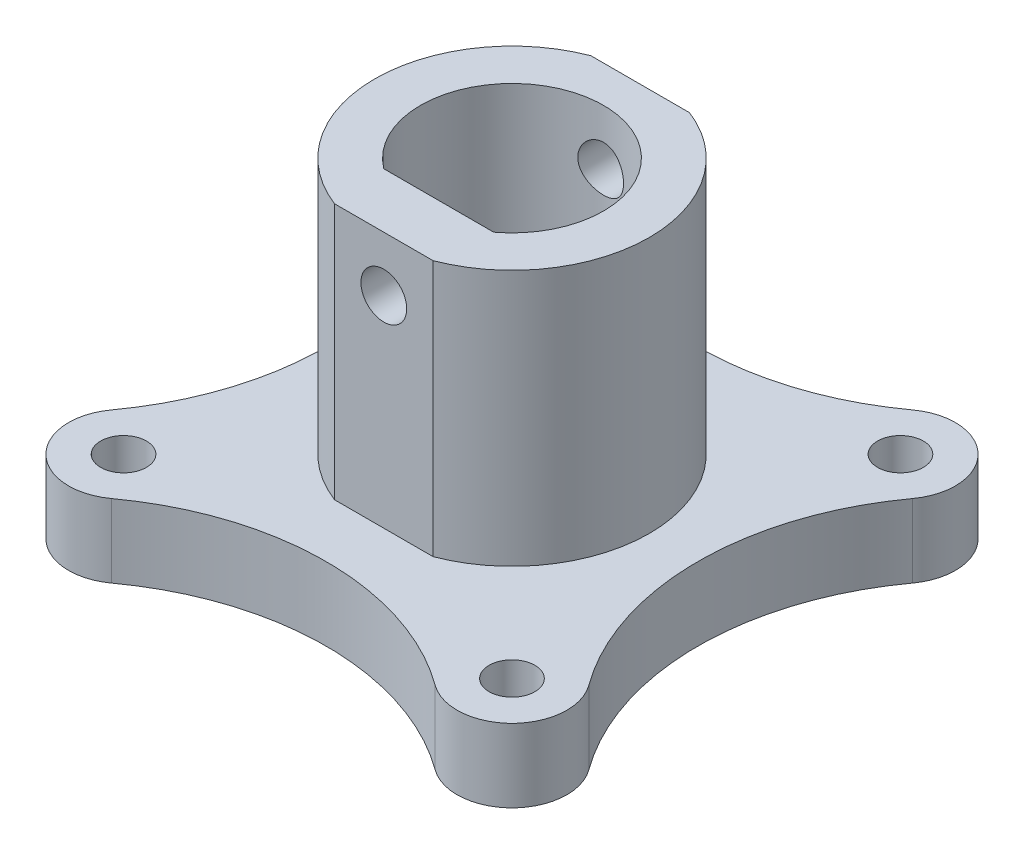
ISO-10303-21;
HEADER;
FILE_DESCRIPTION(('STEP AP214'),'2;1');
FILE_NAME('part.step','',(''),(''),'','','');
FILE_SCHEMA(('AUTOMOTIVE_DESIGN { 1 0 10303 214 1 1 1 1 }'));
ENDSEC;
DATA;
#1=APPLICATION_CONTEXT('core data for automotive mechanical design processes');
#2=APPLICATION_PROTOCOL_DEFINITION('international standard','automotive_design',2000,#1);
#3=PRODUCT_CONTEXT('',#1,'mechanical');
#4=PRODUCT('Part','Part','',(#3));
#5=PRODUCT_RELATED_PRODUCT_CATEGORY('part','',(#4));
#6=PRODUCT_DEFINITION_FORMATION('','',#4);
#7=PRODUCT_DEFINITION_CONTEXT('part definition',#1,'design');
#8=PRODUCT_DEFINITION('design','',#6,#7);
#9=PRODUCT_DEFINITION_SHAPE('','',#8);
#10=(LENGTH_UNIT() NAMED_UNIT(*) SI_UNIT(.MILLI.,.METRE.));
#11=(NAMED_UNIT(*) PLANE_ANGLE_UNIT() SI_UNIT($,.RADIAN.));
#12=(NAMED_UNIT(*) SI_UNIT($,.STERADIAN.) SOLID_ANGLE_UNIT());
#13=UNCERTAINTY_MEASURE_WITH_UNIT(LENGTH_MEASURE(1.E-05),#10,'distance_accuracy_value','');
#14=(GEOMETRIC_REPRESENTATION_CONTEXT(3) GLOBAL_UNCERTAINTY_ASSIGNED_CONTEXT((#13)) GLOBAL_UNIT_ASSIGNED_CONTEXT((#10,
#11,#12)) REPRESENTATION_CONTEXT('',''));
#15=CARTESIAN_POINT('',(0.,0.,0.));
#16=DIRECTION('',(0.,0.,1.));
#17=DIRECTION('',(1.,0.,0.));
#18=AXIS2_PLACEMENT_3D('',#15,#16,#17);
#19=CARTESIAN_POINT('',(-17.8781215039227,4.,-5.3033008588991));
#20=DIRECTION('',(0.,1.,0.));
#21=DIRECTION('',(0.,0.,1.));
#22=AXIS2_PLACEMENT_3D('',#19,#20,#21);
#23=PLANE('',#22);
#24=CARTESIAN_POINT('',(-10.6066017177982,4.,-10.6066017177982));
#25=DIRECTION('',(0.,1.,0.));
#26=DIRECTION('',(0.,0.,1.));
#27=AXIS2_PLACEMENT_3D('',#24,#25,#26);
#28=CIRCLE('',#27,1.24999999999999);
#29=CARTESIAN_POINT('',(-10.6066017177982,4.,-9.35660171779822));
#30=VERTEX_POINT('',#29);
#31=EDGE_CURVE('E337',#30,#30,#28,.T.);
#32=ORIENTED_EDGE('',*,*,#31,.F.);
#33=EDGE_LOOP('',(#32));
#34=FACE_BOUND('',#33,.T.);
#35=CARTESIAN_POINT('',(10.6066017177982,4.,-10.6066017177982));
#36=DIRECTION('',(0.,1.,0.));
#37=DIRECTION('',(0.,0.,1.));
#38=AXIS2_PLACEMENT_3D('',#35,#36,#37);
#39=CIRCLE('',#38,1.24999999999999);
#40=CARTESIAN_POINT('',(10.6066017177982,4.,-9.35660171779823));
#41=VERTEX_POINT('',#40);
#42=EDGE_CURVE('E343',#41,#41,#39,.T.);
#43=ORIENTED_EDGE('',*,*,#42,.F.);
#44=EDGE_LOOP('',(#43));
#45=FACE_BOUND('',#44,.T.);
#46=CARTESIAN_POINT('',(10.6066017177982,4.,10.6066017177982));
#47=DIRECTION('',(0.,1.,0.));
#48=DIRECTION('',(0.,0.,1.));
#49=AXIS2_PLACEMENT_3D('',#46,#47,#48);
#50=CIRCLE('',#49,1.24999999999999);
#51=CARTESIAN_POINT('',(10.6066017177982,4.,11.8566017177982));
#52=VERTEX_POINT('',#51);
#53=EDGE_CURVE('E349',#52,#52,#50,.T.);
#54=ORIENTED_EDGE('',*,*,#53,.F.);
#55=EDGE_LOOP('',(#54));
#56=FACE_BOUND('',#55,.T.);
#57=CARTESIAN_POINT('',(-10.6066017177982,4.,10.6066017177982));
#58=DIRECTION('',(0.,1.,0.));
#59=DIRECTION('',(0.,0.,1.));
#60=AXIS2_PLACEMENT_3D('',#57,#58,#59);
#61=CIRCLE('',#60,1.24999999999999);
#62=CARTESIAN_POINT('',(-10.6066017177982,4.,11.8566017177982));
#63=VERTEX_POINT('',#62);
#64=EDGE_CURVE('E164',#63,#63,#61,.T.);
#65=ORIENTED_EDGE('',*,*,#64,.F.);
#66=EDGE_LOOP('',(#65));
#67=FACE_BOUND('',#66,.T.);
#68=CARTESIAN_POINT('',(-25.1496412900472,4.,0.));
#69=DIRECTION('',(0.,-1.,0.));
#70=DIRECTION('',(0.,0.,1.));
#71=AXIS2_PLACEMENT_3D('',#68,#69,#70);
#72=CIRCLE('',#71,15.);
#73=CARTESIAN_POINT('',(-13.0304416465064,4.,-8.83883476483185));
#74=VERTEX_POINT('',#73);
#75=CARTESIAN_POINT('',(-13.0304416465064,4.,8.83883476483185));
#76=VERTEX_POINT('',#75);
#77=EDGE_CURVE('E198',#74,#76,#72,.T.);
#78=ORIENTED_EDGE('',*,*,#77,.T.);
#79=CARTESIAN_POINT('',(-10.6066017177982,4.,10.6066017177982));
#80=DIRECTION('',(0.,1.,0.));
#81=DIRECTION('',(0.,0.,1.));
#82=AXIS2_PLACEMENT_3D('',#79,#80,#81);
#83=CIRCLE('',#82,3.);
#84=CARTESIAN_POINT('',(-8.83883476483185,4.,13.0304416465064));
#85=VERTEX_POINT('',#84);
#86=EDGE_CURVE('E201',#76,#85,#83,.T.);
#87=ORIENTED_EDGE('',*,*,#86,.T.);
#88=CARTESIAN_POINT('',(0.,4.,25.1496412900472));
#89=DIRECTION('',(0.,-1.,0.));
#90=DIRECTION('',(0.,0.,1.));
#91=AXIS2_PLACEMENT_3D('',#88,#89,#90);
#92=CIRCLE('',#91,15.);
#93=CARTESIAN_POINT('',(8.83883476483185,4.,13.0304416465064));
#94=VERTEX_POINT('',#93);
#95=EDGE_CURVE('E204',#85,#94,#92,.T.);
#96=ORIENTED_EDGE('',*,*,#95,.T.);
#97=CARTESIAN_POINT('',(10.6066017177982,4.,10.6066017177982));
#98=DIRECTION('',(0.,1.,0.));
#99=DIRECTION('',(0.,0.,1.));
#100=AXIS2_PLACEMENT_3D('',#97,#98,#99);
#101=CIRCLE('',#100,3.);
#102=CARTESIAN_POINT('',(13.0304416465064,4.,8.83883476483184));
#103=VERTEX_POINT('',#102);
#104=EDGE_CURVE('E206',#94,#103,#101,.T.);
#105=ORIENTED_EDGE('',*,*,#104,.T.);
#106=CARTESIAN_POINT('',(25.1496412900472,4.,0.));
#107=DIRECTION('',(0.,-1.,0.));
#108=DIRECTION('',(0.,0.,1.));
#109=AXIS2_PLACEMENT_3D('',#106,#107,#108);
#110=CIRCLE('',#109,15.);
#111=CARTESIAN_POINT('',(13.0304416465064,4.,-8.83883476483184));
#112=VERTEX_POINT('',#111);
#113=EDGE_CURVE('E208',#103,#112,#110,.T.);
#114=ORIENTED_EDGE('',*,*,#113,.T.);
#115=CARTESIAN_POINT('',(10.6066017177982,4.,-10.6066017177982));
#116=DIRECTION('',(0.,1.,0.));
#117=DIRECTION('',(0.,0.,1.));
#118=AXIS2_PLACEMENT_3D('',#115,#116,#117);
#119=CIRCLE('',#118,3.);
#120=CARTESIAN_POINT('',(8.83883476483185,4.,-13.0304416465064));
#121=VERTEX_POINT('',#120);
#122=EDGE_CURVE('E210',#112,#121,#119,.T.);
#123=ORIENTED_EDGE('',*,*,#122,.T.);
#124=CARTESIAN_POINT('',(0.,4.,-25.1496412900472));
#125=DIRECTION('',(0.,-1.,0.));
#126=DIRECTION('',(0.,0.,1.));
#127=AXIS2_PLACEMENT_3D('',#124,#125,#126);
#128=CIRCLE('',#127,15.);
#129=CARTESIAN_POINT('',(-8.83883476483185,4.,-13.0304416465064));
#130=VERTEX_POINT('',#129);
#131=EDGE_CURVE('E212',#121,#130,#128,.T.);
#132=ORIENTED_EDGE('',*,*,#131,.T.);
#133=CARTESIAN_POINT('',(-10.6066017177982,4.,-10.6066017177982));
#134=DIRECTION('',(0.,1.,0.));
#135=DIRECTION('',(0.,0.,1.));
#136=AXIS2_PLACEMENT_3D('',#133,#134,#135);
#137=CIRCLE('',#136,3.);
#138=EDGE_CURVE('E214',#130,#74,#137,.T.);
#139=ORIENTED_EDGE('',*,*,#138,.T.);
#140=EDGE_LOOP('',(#78,#87,#96,#105,#114,#123,#132,#139));
#141=FACE_BOUND('',#140,.T.);
#142=DIRECTION('',(1.,0.,0.));
#143=VECTOR('',#142,1.);
#144=CARTESIAN_POINT('',(-2.69258240356725,4.,7.));
#145=LINE('',#144,#143);
#146=CARTESIAN_POINT('',(-2.69258240356725,4.,7.));
#147=VERTEX_POINT('',#146);
#148=CARTESIAN_POINT('',(2.69258240356725,4.,7.));
#149=VERTEX_POINT('',#148);
#150=EDGE_CURVE('E181',#147,#149,#145,.T.);
#151=ORIENTED_EDGE('',*,*,#150,.F.);
#152=CARTESIAN_POINT('',(0.,4.,0.));
#153=DIRECTION('',(0.,1.,0.));
#154=DIRECTION('',(0.,0.,1.));
#155=AXIS2_PLACEMENT_3D('',#152,#153,#154);
#156=CIRCLE('',#155,7.5);
#157=CARTESIAN_POINT('',(-2.69258240356725,4.,-7.));
#158=VERTEX_POINT('',#157);
#159=EDGE_CURVE('E158',#158,#147,#156,.T.);
#160=ORIENTED_EDGE('',*,*,#159,.F.);
#161=DIRECTION('',(-1.,0.,0.));
#162=VECTOR('',#161,1.);
#163=CARTESIAN_POINT('',(-2.69258240356725,4.,-7.));
#164=LINE('',#163,#162);
#165=CARTESIAN_POINT('',(2.69258240356725,4.,-7.));
#166=VERTEX_POINT('',#165);
#167=EDGE_CURVE('E172',#166,#158,#164,.T.);
#168=ORIENTED_EDGE('',*,*,#167,.F.);
#169=CARTESIAN_POINT('',(0.,4.,0.));
#170=DIRECTION('',(0.,1.,0.));
#171=DIRECTION('',(0.,0.,1.));
#172=AXIS2_PLACEMENT_3D('',#169,#170,#171);
#173=CIRCLE('',#172,7.5);
#174=EDGE_CURVE('E183',#149,#166,#173,.T.);
#175=ORIENTED_EDGE('',*,*,#174,.F.);
#176=EDGE_LOOP('',(#151,#160,#168,#175));
#177=FACE_BOUND('',#176,.T.);
#178=ADVANCED_FACE('F37',(#34,#45,#56,#67,#141,#177),#23,.T.);
#179=CARTESIAN_POINT('',(-17.8781215039227,0.,-5.3033008588991));
#180=DIRECTION('',(0.,1.,0.));
#181=DIRECTION('',(0.,0.,1.));
#182=AXIS2_PLACEMENT_3D('',#179,#180,#181);
#183=PLANE('',#182);
#184=CARTESIAN_POINT('',(-10.6066017177982,0.,-10.6066017177982));
#185=DIRECTION('',(0.,1.,0.));
#186=DIRECTION('',(0.,0.,1.));
#187=AXIS2_PLACEMENT_3D('',#184,#185,#186);
#188=CIRCLE('',#187,1.25);
#189=CARTESIAN_POINT('',(-10.6066017177982,0.,-9.35660171779821));
#190=VERTEX_POINT('',#189);
#191=EDGE_CURVE('E340',#190,#190,#188,.T.);
#192=ORIENTED_EDGE('',*,*,#191,.T.);
#193=EDGE_LOOP('',(#192));
#194=FACE_BOUND('',#193,.T.);
#195=CARTESIAN_POINT('',(10.6066017177982,0.,-10.6066017177982));
#196=DIRECTION('',(0.,1.,0.));
#197=DIRECTION('',(0.,0.,1.));
#198=AXIS2_PLACEMENT_3D('',#195,#196,#197);
#199=CIRCLE('',#198,1.25);
#200=CARTESIAN_POINT('',(10.6066017177982,0.,-9.35660171779821));
#201=VERTEX_POINT('',#200);
#202=EDGE_CURVE('E346',#201,#201,#199,.T.);
#203=ORIENTED_EDGE('',*,*,#202,.T.);
#204=EDGE_LOOP('',(#203));
#205=FACE_BOUND('',#204,.T.);
#206=CARTESIAN_POINT('',(10.6066017177982,0.,10.6066017177982));
#207=DIRECTION('',(0.,1.,0.));
#208=DIRECTION('',(0.,0.,1.));
#209=AXIS2_PLACEMENT_3D('',#206,#207,#208);
#210=CIRCLE('',#209,1.25);
#211=CARTESIAN_POINT('',(10.6066017177982,0.,11.8566017177982));
#212=VERTEX_POINT('',#211);
#213=EDGE_CURVE('E352',#212,#212,#210,.T.);
#214=ORIENTED_EDGE('',*,*,#213,.T.);
#215=EDGE_LOOP('',(#214));
#216=FACE_BOUND('',#215,.T.);
#217=CARTESIAN_POINT('',(-10.6066017177982,0.,10.6066017177982));
#218=DIRECTION('',(0.,1.,0.));
#219=DIRECTION('',(0.,0.,1.));
#220=AXIS2_PLACEMENT_3D('',#217,#218,#219);
#221=CIRCLE('',#220,1.25);
#222=CARTESIAN_POINT('',(-10.6066017177982,0.,11.8566017177982));
#223=VERTEX_POINT('',#222);
#224=EDGE_CURVE('E161',#223,#223,#221,.T.);
#225=ORIENTED_EDGE('',*,*,#224,.T.);
#226=EDGE_LOOP('',(#225));
#227=FACE_BOUND('',#226,.T.);
#228=CARTESIAN_POINT('',(-25.1496412900472,0.,0.));
#229=DIRECTION('',(0.,-1.,0.));
#230=DIRECTION('',(0.,0.,1.));
#231=AXIS2_PLACEMENT_3D('',#228,#229,#230);
#232=CIRCLE('',#231,15.);
#233=CARTESIAN_POINT('',(-13.0304416465064,0.,-8.83883476483185));
#234=VERTEX_POINT('',#233);
#235=CARTESIAN_POINT('',(-13.0304416465064,0.,8.83883476483185));
#236=VERTEX_POINT('',#235);
#237=EDGE_CURVE('E197',#234,#236,#232,.T.);
#238=ORIENTED_EDGE('',*,*,#237,.F.);
#239=CARTESIAN_POINT('',(-10.6066017177982,0.,-10.6066017177982));
#240=DIRECTION('',(0.,1.,0.));
#241=DIRECTION('',(0.,0.,1.));
#242=AXIS2_PLACEMENT_3D('',#239,#240,#241);
#243=CIRCLE('',#242,3.);
#244=CARTESIAN_POINT('',(-8.83883476483185,0.,-13.0304416465064));
#245=VERTEX_POINT('',#244);
#246=EDGE_CURVE('E202',#245,#234,#243,.T.);
#247=ORIENTED_EDGE('',*,*,#246,.F.);
#248=CARTESIAN_POINT('',(0.,0.,-25.1496412900472));
#249=DIRECTION('',(0.,-1.,0.));
#250=DIRECTION('',(0.,0.,1.));
#251=AXIS2_PLACEMENT_3D('',#248,#249,#250);
#252=CIRCLE('',#251,15.);
#253=CARTESIAN_POINT('',(8.83883476483185,0.,-13.0304416465064));
#254=VERTEX_POINT('',#253);
#255=EDGE_CURVE('E229',#254,#245,#252,.T.);
#256=ORIENTED_EDGE('',*,*,#255,.F.);
#257=CARTESIAN_POINT('',(10.6066017177982,0.,-10.6066017177982));
#258=DIRECTION('',(0.,1.,0.));
#259=DIRECTION('',(0.,0.,1.));
#260=AXIS2_PLACEMENT_3D('',#257,#258,#259);
#261=CIRCLE('',#260,3.);
#262=CARTESIAN_POINT('',(13.0304416465064,0.,-8.83883476483184));
#263=VERTEX_POINT('',#262);
#264=EDGE_CURVE('E227',#263,#254,#261,.T.);
#265=ORIENTED_EDGE('',*,*,#264,.F.);
#266=CARTESIAN_POINT('',(25.1496412900472,0.,0.));
#267=DIRECTION('',(0.,-1.,0.));
#268=DIRECTION('',(0.,0.,1.));
#269=AXIS2_PLACEMENT_3D('',#266,#267,#268);
#270=CIRCLE('',#269,15.);
#271=CARTESIAN_POINT('',(13.0304416465064,0.,8.83883476483184));
#272=VERTEX_POINT('',#271);
#273=EDGE_CURVE('E225',#272,#263,#270,.T.);
#274=ORIENTED_EDGE('',*,*,#273,.F.);
#275=CARTESIAN_POINT('',(10.6066017177982,0.,10.6066017177982));
#276=DIRECTION('',(0.,1.,0.));
#277=DIRECTION('',(0.,0.,1.));
#278=AXIS2_PLACEMENT_3D('',#275,#276,#277);
#279=CIRCLE('',#278,3.);
#280=CARTESIAN_POINT('',(8.83883476483185,0.,13.0304416465064));
#281=VERTEX_POINT('',#280);
#282=EDGE_CURVE('E223',#281,#272,#279,.T.);
#283=ORIENTED_EDGE('',*,*,#282,.F.);
#284=CARTESIAN_POINT('',(0.,0.,25.1496412900472));
#285=DIRECTION('',(0.,-1.,0.));
#286=DIRECTION('',(0.,0.,1.));
#287=AXIS2_PLACEMENT_3D('',#284,#285,#286);
#288=CIRCLE('',#287,15.);
#289=CARTESIAN_POINT('',(-8.83883476483185,0.,13.0304416465064));
#290=VERTEX_POINT('',#289);
#291=EDGE_CURVE('E221',#290,#281,#288,.T.);
#292=ORIENTED_EDGE('',*,*,#291,.F.);
#293=CARTESIAN_POINT('',(-10.6066017177982,0.,10.6066017177982));
#294=DIRECTION('',(0.,1.,0.));
#295=DIRECTION('',(0.,0.,1.));
#296=AXIS2_PLACEMENT_3D('',#293,#294,#295);
#297=CIRCLE('',#296,3.);
#298=EDGE_CURVE('E219',#236,#290,#297,.T.);
#299=ORIENTED_EDGE('',*,*,#298,.F.);
#300=EDGE_LOOP('',(#238,#247,#256,#265,#274,#283,#292,#299));
#301=FACE_BOUND('',#300,.T.);
#302=CARTESIAN_POINT('',(0.,0.,0.));
#303=DIRECTION('',(0.,1.,0.));
#304=DIRECTION('',(0.,0.,1.));
#305=AXIS2_PLACEMENT_3D('',#302,#303,#304);
#306=CIRCLE('',#305,5.);
#307=CARTESIAN_POINT('',(3.,0.,4.));
#308=VERTEX_POINT('',#307);
#309=CARTESIAN_POINT('',(-3.,0.,4.));
#310=VERTEX_POINT('',#309);
#311=EDGE_CURVE('E66',#308,#310,#306,.T.);
#312=ORIENTED_EDGE('',*,*,#311,.T.);
#313=DIRECTION('',(1.,0.,0.));
#314=VECTOR('',#313,1.);
#315=CARTESIAN_POINT('',(-3.,0.,4.));
#316=LINE('',#315,#314);
#317=EDGE_CURVE('E153',#310,#308,#316,.T.);
#318=ORIENTED_EDGE('',*,*,#317,.T.);
#319=EDGE_LOOP('',(#312,#318));
#320=FACE_BOUND('',#319,.T.);
#321=ADVANCED_FACE('F260',(#194,#205,#216,#227,#301,#320),#183,.F.);
#322=CARTESIAN_POINT('',(-25.1496412900472,4.,0.));
#323=DIRECTION('',(0.,-1.,0.));
#324=DIRECTION('',(0.,0.,-1.));
#325=AXIS2_PLACEMENT_3D('',#322,#323,#324);
#326=CYLINDRICAL_SURFACE('',#325,15.);
#327=ORIENTED_EDGE('',*,*,#237,.T.);
#328=DIRECTION('',(0.,-1.,0.));
#329=VECTOR('',#328,1.);
#330=CARTESIAN_POINT('',(-13.0304416465064,4.,8.83883476483185));
#331=LINE('',#330,#329);
#332=EDGE_CURVE('E11',#76,#236,#331,.T.);
#333=ORIENTED_EDGE('',*,*,#332,.F.);
#334=ORIENTED_EDGE('',*,*,#77,.F.);
#335=DIRECTION('',(0.,-1.,0.));
#336=VECTOR('',#335,1.);
#337=CARTESIAN_POINT('',(-13.0304416465064,4.,-8.83883476483185));
#338=LINE('',#337,#336);
#339=EDGE_CURVE('E216',#74,#234,#338,.T.);
#340=ORIENTED_EDGE('',*,*,#339,.T.);
#341=EDGE_LOOP('',(#327,#333,#334,#340));
#342=FACE_BOUND('',#341,.T.);
#343=ADVANCED_FACE('F39',(#342),#326,.F.);
#344=CARTESIAN_POINT('',(-10.6066017177982,4.,10.6066017177982));
#345=DIRECTION('',(0.,-1.,0.));
#346=DIRECTION('',(0.,0.,-1.));
#347=AXIS2_PLACEMENT_3D('',#344,#345,#346);
#348=CYLINDRICAL_SURFACE('',#347,3.);
#349=ORIENTED_EDGE('',*,*,#298,.T.);
#350=DIRECTION('',(0.,-1.,0.));
#351=VECTOR('',#350,1.);
#352=CARTESIAN_POINT('',(-8.83883476483185,4.,13.0304416465064));
#353=LINE('',#352,#351);
#354=EDGE_CURVE('E51',#85,#290,#353,.T.);
#355=ORIENTED_EDGE('',*,*,#354,.F.);
#356=ORIENTED_EDGE('',*,*,#86,.F.);
#357=ORIENTED_EDGE('',*,*,#332,.T.);
#358=EDGE_LOOP('',(#349,#355,#356,#357));
#359=FACE_BOUND('',#358,.T.);
#360=ADVANCED_FACE('F278',(#359),#348,.T.);
#361=CARTESIAN_POINT('',(0.,4.,25.1496412900472));
#362=DIRECTION('',(0.,-1.,0.));
#363=DIRECTION('',(0.,0.,-1.));
#364=AXIS2_PLACEMENT_3D('',#361,#362,#363);
#365=CYLINDRICAL_SURFACE('',#364,15.);
#366=ORIENTED_EDGE('',*,*,#291,.T.);
#367=DIRECTION('',(0.,-1.,0.));
#368=VECTOR('',#367,1.);
#369=CARTESIAN_POINT('',(8.83883476483185,4.,13.0304416465064));
#370=LINE('',#369,#368);
#371=EDGE_CURVE('E246',#94,#281,#370,.T.);
#372=ORIENTED_EDGE('',*,*,#371,.F.);
#373=ORIENTED_EDGE('',*,*,#95,.F.);
#374=ORIENTED_EDGE('',*,*,#354,.T.);
#375=EDGE_LOOP('',(#366,#372,#373,#374));
#376=FACE_BOUND('',#375,.T.);
#377=ADVANCED_FACE('F254',(#376),#365,.F.);
#378=CARTESIAN_POINT('',(10.6066017177982,4.,10.6066017177982));
#379=DIRECTION('',(0.,-1.,0.));
#380=DIRECTION('',(0.,0.,-1.));
#381=AXIS2_PLACEMENT_3D('',#378,#379,#380);
#382=CYLINDRICAL_SURFACE('',#381,3.);
#383=ORIENTED_EDGE('',*,*,#282,.T.);
#384=DIRECTION('',(0.,-1.,0.));
#385=VECTOR('',#384,1.);
#386=CARTESIAN_POINT('',(13.0304416465064,4.,8.83883476483184));
#387=LINE('',#386,#385);
#388=EDGE_CURVE('E243',#103,#272,#387,.T.);
#389=ORIENTED_EDGE('',*,*,#388,.F.);
#390=ORIENTED_EDGE('',*,*,#104,.F.);
#391=ORIENTED_EDGE('',*,*,#371,.T.);
#392=EDGE_LOOP('',(#383,#389,#390,#391));
#393=FACE_BOUND('',#392,.T.);
#394=ADVANCED_FACE('F266',(#393),#382,.T.);
#395=CARTESIAN_POINT('',(25.1496412900472,4.,0.));
#396=DIRECTION('',(0.,-1.,0.));
#397=DIRECTION('',(0.,0.,-1.));
#398=AXIS2_PLACEMENT_3D('',#395,#396,#397);
#399=CYLINDRICAL_SURFACE('',#398,15.);
#400=ORIENTED_EDGE('',*,*,#273,.T.);
#401=DIRECTION('',(0.,-1.,0.));
#402=VECTOR('',#401,1.);
#403=CARTESIAN_POINT('',(13.0304416465064,4.,-8.83883476483184));
#404=LINE('',#403,#402);
#405=EDGE_CURVE('E240',#112,#263,#404,.T.);
#406=ORIENTED_EDGE('',*,*,#405,.F.);
#407=ORIENTED_EDGE('',*,*,#113,.F.);
#408=ORIENTED_EDGE('',*,*,#388,.T.);
#409=EDGE_LOOP('',(#400,#406,#407,#408));
#410=FACE_BOUND('',#409,.T.);
#411=ADVANCED_FACE('F270',(#410),#399,.F.);
#412=CARTESIAN_POINT('',(10.6066017177982,4.,-10.6066017177982));
#413=DIRECTION('',(0.,-1.,0.));
#414=DIRECTION('',(0.,0.,-1.));
#415=AXIS2_PLACEMENT_3D('',#412,#413,#414);
#416=CYLINDRICAL_SURFACE('',#415,3.);
#417=ORIENTED_EDGE('',*,*,#264,.T.);
#418=DIRECTION('',(0.,-1.,0.));
#419=VECTOR('',#418,1.);
#420=CARTESIAN_POINT('',(8.83883476483185,4.,-13.0304416465064));
#421=LINE('',#420,#419);
#422=EDGE_CURVE('E237',#121,#254,#421,.T.);
#423=ORIENTED_EDGE('',*,*,#422,.F.);
#424=ORIENTED_EDGE('',*,*,#122,.F.);
#425=ORIENTED_EDGE('',*,*,#405,.T.);
#426=EDGE_LOOP('',(#417,#423,#424,#425));
#427=FACE_BOUND('',#426,.T.);
#428=ADVANCED_FACE('F291',(#427),#416,.T.);
#429=CARTESIAN_POINT('',(0.,4.,-25.1496412900472));
#430=DIRECTION('',(0.,-1.,0.));
#431=DIRECTION('',(0.,0.,-1.));
#432=AXIS2_PLACEMENT_3D('',#429,#430,#431);
#433=CYLINDRICAL_SURFACE('',#432,15.);
#434=ORIENTED_EDGE('',*,*,#255,.T.);
#435=DIRECTION('',(0.,-1.,0.));
#436=VECTOR('',#435,1.);
#437=CARTESIAN_POINT('',(-8.83883476483185,4.,-13.0304416465064));
#438=LINE('',#437,#436);
#439=EDGE_CURVE('E234',#130,#245,#438,.T.);
#440=ORIENTED_EDGE('',*,*,#439,.F.);
#441=ORIENTED_EDGE('',*,*,#131,.F.);
#442=ORIENTED_EDGE('',*,*,#422,.T.);
#443=EDGE_LOOP('',(#434,#440,#441,#442));
#444=FACE_BOUND('',#443,.T.);
#445=ADVANCED_FACE('F289',(#444),#433,.F.);
#446=CARTESIAN_POINT('',(-10.6066017177982,4.,-10.6066017177982));
#447=DIRECTION('',(0.,-1.,0.));
#448=DIRECTION('',(0.,0.,-1.));
#449=AXIS2_PLACEMENT_3D('',#446,#447,#448);
#450=CYLINDRICAL_SURFACE('',#449,3.);
#451=ORIENTED_EDGE('',*,*,#246,.T.);
#452=ORIENTED_EDGE('',*,*,#339,.F.);
#453=ORIENTED_EDGE('',*,*,#138,.F.);
#454=ORIENTED_EDGE('',*,*,#439,.T.);
#455=EDGE_LOOP('',(#451,#452,#453,#454));
#456=FACE_BOUND('',#455,.T.);
#457=ADVANCED_FACE('F284',(#456),#450,.T.);
#458=CARTESIAN_POINT('',(0.,4.,0.));
#459=DIRECTION('',(0.,-1.,0.));
#460=DIRECTION('',(0.,0.,-1.));
#461=AXIS2_PLACEMENT_3D('',#458,#459,#460);
#462=CYLINDRICAL_SURFACE('',#461,5.);
#463=CARTESIAN_POINT('',(1.24999999999999,15.,-4.84122918275927));
#464=CARTESIAN_POINT('',(1.24999803929588,15.0690253754623,-4.84123050042654));
#465=CARTESIAN_POINT('',(1.24426312274864,15.138072449339,-4.84272153006957));
#466=CARTESIAN_POINT('',(1.22151156273206,15.274183789087,-4.84850930996624));
#467=CARTESIAN_POINT('',(1.20448835337109,15.3412468772342,-4.85280769310907));
#468=CARTESIAN_POINT('',(1.15974559981597,15.4714017690935,-4.86369362297984));
#469=CARTESIAN_POINT('',(1.13203986392723,15.5344985776928,-4.87027821345205));
#470=CARTESIAN_POINT('',(1.0667605706307,15.65515542627,-4.88499096014404));
#471=CARTESIAN_POINT('',(1.02918659428034,15.7127152310401,-4.89311918189251));
#472=CARTESIAN_POINT('',(0.94435421365593,15.8219308226311,-4.91020358177806));
#473=CARTESIAN_POINT('',(0.896918443852017,15.873446800175,-4.91917298811515));
#474=CARTESIAN_POINT('',(0.794091032050326,15.9678806971802,-4.93681437757649));
#475=CARTESIAN_POINT('',(0.738698647090148,16.0107978128109,-4.94548633283195));
#476=CARTESIAN_POINT('',(0.620572600539472,16.0873877338156,-4.96170207760291));
#477=CARTESIAN_POINT('',(0.557747288097555,16.1209231940807,-4.96922843700296));
#478=CARTESIAN_POINT('',(0.427131592146377,16.1769048220765,-4.98215405962992));
#479=CARTESIAN_POINT('',(0.359341942895966,16.1993526259578,-4.98755363667172));
#480=CARTESIAN_POINT('',(0.222179379377077,16.2320739172893,-4.9955237942409));
#481=CARTESIAN_POINT('',(0.152866359774484,16.2425848221633,-4.99814946922157));
#482=CARTESIAN_POINT('',(0.0134144096313822,16.2518791896378,-5.00046797053649));
#483=CARTESIAN_POINT('',(-0.0567243972690364,16.2506643861048,-5.00016123048352));
#484=CARTESIAN_POINT('',(-0.194190308965485,16.2367125748749,-4.99669047476767));
#485=CARTESIAN_POINT('',(-0.261545269501334,16.2242318374731,-4.99359001170437));
#486=CARTESIAN_POINT('',(-0.393172809267107,16.1885143649757,-4.98495418262427));
#487=CARTESIAN_POINT('',(-0.457445224213046,16.1652770573113,-4.9794186869922));
#488=CARTESIAN_POINT('',(-0.581758379377256,16.1084987146565,-4.96643754850448));
#489=CARTESIAN_POINT('',(-0.641755637208128,16.0748664776691,-4.95897509847527));
#490=CARTESIAN_POINT('',(-0.755344527925607,15.9983221604419,-4.94294951904825));
#491=CARTESIAN_POINT('',(-0.808935043856878,15.9554084657197,-4.93438619826245));
#492=CARTESIAN_POINT('',(-0.909717543856191,15.8601456290088,-4.9168185688476));
#493=CARTESIAN_POINT('',(-0.956697098843995,15.8075725538261,-4.90780859762959));
#494=CARTESIAN_POINT('',(-1.04122046995377,15.6952000132299,-4.89057521758353));
#495=CARTESIAN_POINT('',(-1.07876384505751,15.6354002102545,-4.88235184552985));
#496=CARTESIAN_POINT('',(-1.14348516127824,15.5098549829255,-4.86760248415824));
#497=CARTESIAN_POINT('',(-1.17061195871311,15.4440821348434,-4.8610849186286));
#498=CARTESIAN_POINT('',(-1.21335702579542,15.3087072659618,-4.85059320069979));
#499=CARTESIAN_POINT('',(-1.22897775819113,15.2391060680084,-4.84661850405109));
#500=CARTESIAN_POINT('',(-1.24791481933258,15.1000202492384,-4.84177678019571));
#501=CARTESIAN_POINT('',(-1.2515452369598,15.0305811033352,-4.84083044546824));
#502=CARTESIAN_POINT('',(-1.24725849525776,14.8920890317109,-4.8419367174052));
#503=CARTESIAN_POINT('',(-1.23934239892439,14.8230360710244,-4.84398904800633));
#504=CARTESIAN_POINT('',(-1.21246273196882,14.6884428675227,-4.85078540977281));
#505=CARTESIAN_POINT('',(-1.19368203414086,14.6228636367146,-4.85548485117188));
#506=CARTESIAN_POINT('',(-1.1458090408353,14.4957842710742,-4.86700359135481));
#507=CARTESIAN_POINT('',(-1.11671552385626,14.4342846204723,-4.87382314124307));
#508=CARTESIAN_POINT('',(-1.04838533396827,14.3157793610663,-4.88898068546631));
#509=CARTESIAN_POINT('',(-1.00896087691781,14.2588855799785,-4.89734584303321));
#510=CARTESIAN_POINT('',(-0.921325366168062,14.1524058185993,-4.91458541535858));
#511=CARTESIAN_POINT('',(-0.873112868506792,14.102821041675,-4.92345991364235));
#512=CARTESIAN_POINT('',(-0.7678284012309,14.0110944787145,-4.94098701515803));
#513=CARTESIAN_POINT('',(-0.710564940664484,13.9691699687256,-4.94962851030918));
#514=CARTESIAN_POINT('',(-0.589628353368338,13.8955320665244,-4.96548608306867));
#515=CARTESIAN_POINT('',(-0.525955561196984,13.8638181416959,-4.9727022350198));
#516=CARTESIAN_POINT('',(-0.394447752163859,13.811776982736,-4.98485057869157));
#517=CARTESIAN_POINT('',(-0.326646726284848,13.7913678578105,-4.98979915011205));
#518=CARTESIAN_POINT('',(-0.188437200398507,13.7622698326958,-4.99692646697894));
#519=CARTESIAN_POINT('',(-0.118029206301552,13.7535786706305,-4.99910574696704));
#520=CARTESIAN_POINT('',(0.0213544080541593,13.7482905130306,-5.00042711761014));
#521=CARTESIAN_POINT('',(0.0903172837075423,13.7513728636308,-4.9996497360001));
#522=CARTESIAN_POINT('',(0.226709370518424,13.7688097841179,-4.99532370571779));
#523=CARTESIAN_POINT('',(0.294138627226108,13.7831640187664,-4.99177513946369));
#524=CARTESIAN_POINT('',(0.425213794556019,13.8225652747137,-4.98231791067453));
#525=CARTESIAN_POINT('',(0.488878118226273,13.8475543166433,-4.97642205628333));
#526=CARTESIAN_POINT('',(0.611146316301834,13.9074632237742,-4.9628911114173));
#527=CARTESIAN_POINT('',(0.669749551581312,13.942384340837,-4.9552558017217));
#528=CARTESIAN_POINT('',(0.78175241052987,14.0221440424964,-4.93884062101666));
#529=CARTESIAN_POINT('',(0.834993735375727,14.0672001786342,-4.93003771182014));
#530=CARTESIAN_POINT('',(0.933268775339064,14.1655285649673,-4.91238311316553));
#531=CARTESIAN_POINT('',(0.978300406335231,14.2188028951224,-4.90353141190695));
#532=CARTESIAN_POINT('',(1.05970253309903,14.3332517677517,-4.88659344825685));
#533=CARTESIAN_POINT('',(1.09589577430818,14.3945551542658,-4.87852454662356));
#534=CARTESIAN_POINT('',(1.15740862076957,14.5225693624034,-4.8642994443827));
#535=CARTESIAN_POINT('',(1.18273613719964,14.5892762076334,-4.85814185308379));
#536=CARTESIAN_POINT('',(1.21802816070679,14.7132212647834,-4.84939885924729));
#537=CARTESIAN_POINT('',(1.22999146324422,14.7698664554798,-4.84635828750683));
#538=CARTESIAN_POINT('',(1.24597786571658,14.88433608625,-4.84227298231965));
#539=CARTESIAN_POINT('',(1.25000164296522,14.9421604253063,-4.84122807862454));
#540=CARTESIAN_POINT('',(1.24999999999999,15.,-4.84122918275927));
#541=B_SPLINE_CURVE_WITH_KNOTS('',3,(#463,#464,#465,#466,#467,#468,#469,#470,#471,#472,#473,
#474,#475,#476,#477,#478,#479,#480,#481,#482,#483,#484,#485,#486,#487,#488,#489,#490,#491,#492,
#493,#494,#495,#496,#497,#498,#499,#500,#501,#502,#503,#504,#505,#506,#507,#508,#509,#510,#511,
#512,#513,#514,#515,#516,#517,#518,#519,#520,#521,#522,#523,#524,#525,#526,#527,#528,#529,#530,
#531,#532,#533,#534,#535,#536,#537,#538,#539,#540),.UNSPECIFIED.,.T.,.F.,(4,2,2,2,2,2,2,2,2,2,2,
2,2,2,2,2,2,2,2,2,2,2,2,2,2,2,2,2,2,2,2,2,2,2,2,2,2,2,4),(0.,0.206863720868068,
0.413847870714331,0.620565363583005,0.827291633777389,1.03811977096488,1.24896760739932,
1.46275748198959,1.67651579923545,1.88594375497672,2.09534074333009,2.30009131344472,
2.50485278362391,2.71146437127221,2.91811192734455,3.13035233285954,3.34260265599899,
3.55588216004199,3.76911600064771,3.97671787380856,4.18430063591898,4.388487025046,
4.59269760710706,4.80091422929576,5.00916509442519,5.22262665482656,5.43607707859773,
5.64796036403461,5.85980274454515,6.06591723063724,6.27202558688486,6.47702438279851,
6.68204902869032,6.89198548291031,7.10197515782749,7.31588238642333,7.52963360683305,
7.7029891358866,7.87632987549755),.UNSPECIFIED.);
#542=CARTESIAN_POINT('',(1.24999999999999,15.,-4.84122918275927));
#543=VERTEX_POINT('',#542);
#544=EDGE_CURVE('E41',#543,#543,#541,.T.);
#545=ORIENTED_EDGE('',*,*,#544,.F.);
#546=EDGE_LOOP('',(#545));
#547=FACE_BOUND('',#546,.T.);
#548=ORIENTED_EDGE('',*,*,#311,.F.);
#549=DIRECTION('',(0.,-1.,0.));
#550=VECTOR('',#549,1.);
#551=CARTESIAN_POINT('',(3.,4.,4.));
#552=LINE('',#551,#550);
#553=CARTESIAN_POINT('',(3.,18.,4.));
#554=VERTEX_POINT('',#553);
#555=EDGE_CURVE('E144',#554,#308,#552,.T.);
#556=ORIENTED_EDGE('',*,*,#555,.F.);
#557=CARTESIAN_POINT('',(0.,18.,0.));
#558=DIRECTION('',(0.,1.,0.));
#559=DIRECTION('',(0.,0.,1.));
#560=AXIS2_PLACEMENT_3D('',#557,#558,#559);
#561=CIRCLE('',#560,5.);
#562=CARTESIAN_POINT('',(-3.,18.,4.));
#563=VERTEX_POINT('',#562);
#564=EDGE_CURVE('E148',#554,#563,#561,.T.);
#565=ORIENTED_EDGE('',*,*,#564,.T.);
#566=DIRECTION('',(0.,-1.,0.));
#567=VECTOR('',#566,1.);
#568=CARTESIAN_POINT('',(-3.,4.,4.));
#569=LINE('',#568,#567);
#570=EDGE_CURVE('E152',#563,#310,#569,.T.);
#571=ORIENTED_EDGE('',*,*,#570,.T.);
#572=EDGE_LOOP('',(#548,#556,#565,#571));
#573=FACE_BOUND('',#572,.T.);
#574=ADVANCED_FACE('F146',(#547,#573),#462,.F.);
#575=CARTESIAN_POINT('',(-3.,4.,4.));
#576=DIRECTION('',(0.,0.,-1.));
#577=DIRECTION('',(-1.,0.,0.));
#578=AXIS2_PLACEMENT_3D('',#575,#576,#577);
#579=PLANE('',#578);
#580=CARTESIAN_POINT('',(0.,15.,4.));
#581=DIRECTION('',(0.,0.,-1.));
#582=DIRECTION('',(-1.,0.,0.));
#583=AXIS2_PLACEMENT_3D('',#580,#581,#582);
#584=CIRCLE('',#583,1.24999999999999);
#585=CARTESIAN_POINT('',(-1.24999999999999,15.,4.));
#586=VERTEX_POINT('',#585);
#587=EDGE_CURVE('E328',#586,#586,#584,.T.);
#588=ORIENTED_EDGE('',*,*,#587,.F.);
#589=EDGE_LOOP('',(#588));
#590=FACE_BOUND('',#589,.T.);
#591=ORIENTED_EDGE('',*,*,#317,.F.);
#592=ORIENTED_EDGE('',*,*,#570,.F.);
#593=DIRECTION('',(1.,0.,0.));
#594=VECTOR('',#593,1.);
#595=CARTESIAN_POINT('',(-3.,18.,4.));
#596=LINE('',#595,#594);
#597=EDGE_CURVE('E155',#563,#554,#596,.T.);
#598=ORIENTED_EDGE('',*,*,#597,.T.);
#599=ORIENTED_EDGE('',*,*,#555,.T.);
#600=EDGE_LOOP('',(#591,#592,#598,#599));
#601=FACE_BOUND('',#600,.T.);
#602=ADVANCED_FACE('F156',(#590,#601),#579,.T.);
#603=CARTESIAN_POINT('',(0.,18.,0.));
#604=DIRECTION('',(0.,1.,0.));
#605=DIRECTION('',(0.,0.,1.));
#606=AXIS2_PLACEMENT_3D('',#603,#604,#605);
#607=PLANE('',#606);
#608=CARTESIAN_POINT('',(0.,18.,0.));
#609=DIRECTION('',(0.,1.,0.));
#610=DIRECTION('',(0.,0.,1.));
#611=AXIS2_PLACEMENT_3D('',#608,#609,#610);
#612=CIRCLE('',#611,7.5);
#613=CARTESIAN_POINT('',(-2.69258240356725,18.,-7.));
#614=VERTEX_POINT('',#613);
#615=CARTESIAN_POINT('',(-2.69258240356725,18.,7.));
#616=VERTEX_POINT('',#615);
#617=EDGE_CURVE('E168',#614,#616,#612,.T.);
#618=ORIENTED_EDGE('',*,*,#617,.T.);
#619=DIRECTION('',(1.,0.,0.));
#620=VECTOR('',#619,1.);
#621=CARTESIAN_POINT('',(-2.69258240356725,18.,7.));
#622=LINE('',#621,#620);
#623=CARTESIAN_POINT('',(2.69258240356725,18.,7.));
#624=VERTEX_POINT('',#623);
#625=EDGE_CURVE('E171',#616,#624,#622,.T.);
#626=ORIENTED_EDGE('',*,*,#625,.T.);
#627=CARTESIAN_POINT('',(0.,18.,0.));
#628=DIRECTION('',(0.,1.,0.));
#629=DIRECTION('',(0.,0.,1.));
#630=AXIS2_PLACEMENT_3D('',#627,#628,#629);
#631=CIRCLE('',#630,7.5);
#632=CARTESIAN_POINT('',(2.69258240356725,18.,-7.));
#633=VERTEX_POINT('',#632);
#634=EDGE_CURVE('E174',#624,#633,#631,.T.);
#635=ORIENTED_EDGE('',*,*,#634,.T.);
#636=DIRECTION('',(-1.,0.,0.));
#637=VECTOR('',#636,1.);
#638=CARTESIAN_POINT('',(-2.69258240356725,18.,-7.));
#639=LINE('',#638,#637);
#640=EDGE_CURVE('E176',#633,#614,#639,.T.);
#641=ORIENTED_EDGE('',*,*,#640,.T.);
#642=EDGE_LOOP('',(#618,#626,#635,#641));
#643=FACE_BOUND('',#642,.T.);
#644=ORIENTED_EDGE('',*,*,#597,.F.);
#645=ORIENTED_EDGE('',*,*,#564,.F.);
#646=EDGE_LOOP('',(#644,#645));
#647=FACE_BOUND('',#646,.T.);
#648=ADVANCED_FACE('F160',(#643,#647),#607,.T.);
#649=CARTESIAN_POINT('',(0.,18.,0.));
#650=DIRECTION('',(0.,-1.,0.));
#651=DIRECTION('',(0.,0.,-1.));
#652=AXIS2_PLACEMENT_3D('',#649,#650,#651);
#653=CYLINDRICAL_SURFACE('',#652,7.5);
#654=ORIENTED_EDGE('',*,*,#159,.T.);
#655=DIRECTION('',(0.,-1.,0.));
#656=VECTOR('',#655,1.);
#657=CARTESIAN_POINT('',(-2.69258240356725,18.,7.));
#658=LINE('',#657,#656);
#659=EDGE_CURVE('E192',#616,#147,#658,.T.);
#660=ORIENTED_EDGE('',*,*,#659,.F.);
#661=ORIENTED_EDGE('',*,*,#617,.F.);
#662=DIRECTION('',(0.,-1.,0.));
#663=VECTOR('',#662,1.);
#664=CARTESIAN_POINT('',(-2.69258240356725,18.,-7.));
#665=LINE('',#664,#663);
#666=EDGE_CURVE('E178',#614,#158,#665,.T.);
#667=ORIENTED_EDGE('',*,*,#666,.T.);
#668=EDGE_LOOP('',(#654,#660,#661,#667));
#669=FACE_BOUND('',#668,.T.);
#670=ADVANCED_FACE('F378',(#669),#653,.T.);
#671=CARTESIAN_POINT('',(-2.69258240356725,18.,7.));
#672=DIRECTION('',(0.,0.,-1.));
#673=DIRECTION('',(-1.,0.,0.));
#674=AXIS2_PLACEMENT_3D('',#671,#672,#673);
#675=PLANE('',#674);
#676=CARTESIAN_POINT('',(0.,15.,7.));
#677=DIRECTION('',(0.,0.,1.));
#678=DIRECTION('',(1.,0.,0.));
#679=AXIS2_PLACEMENT_3D('',#676,#677,#678);
#680=CIRCLE('',#679,1.24999999999999);
#681=CARTESIAN_POINT('',(1.24999999999999,15.,7.));
#682=VERTEX_POINT('',#681);
#683=EDGE_CURVE('E326',#682,#682,#680,.T.);
#684=ORIENTED_EDGE('',*,*,#683,.F.);
#685=EDGE_LOOP('',(#684));
#686=FACE_BOUND('',#685,.T.);
#687=ORIENTED_EDGE('',*,*,#150,.T.);
#688=DIRECTION('',(0.,-1.,0.));
#689=VECTOR('',#688,1.);
#690=CARTESIAN_POINT('',(2.69258240356725,18.,7.));
#691=LINE('',#690,#689);
#692=EDGE_CURVE('E189',#624,#149,#691,.T.);
#693=ORIENTED_EDGE('',*,*,#692,.F.);
#694=ORIENTED_EDGE('',*,*,#625,.F.);
#695=ORIENTED_EDGE('',*,*,#659,.T.);
#696=EDGE_LOOP('',(#687,#693,#694,#695));
#697=FACE_BOUND('',#696,.T.);
#698=ADVANCED_FACE('F383',(#686,#697),#675,.F.);
#699=CARTESIAN_POINT('',(0.,18.,0.));
#700=DIRECTION('',(0.,-1.,0.));
#701=DIRECTION('',(0.,0.,-1.));
#702=AXIS2_PLACEMENT_3D('',#699,#700,#701);
#703=CYLINDRICAL_SURFACE('',#702,7.5);
#704=ORIENTED_EDGE('',*,*,#174,.T.);
#705=DIRECTION('',(0.,-1.,0.));
#706=VECTOR('',#705,1.);
#707=CARTESIAN_POINT('',(2.69258240356725,18.,-7.));
#708=LINE('',#707,#706);
#709=EDGE_CURVE('E58',#633,#166,#708,.T.);
#710=ORIENTED_EDGE('',*,*,#709,.F.);
#711=ORIENTED_EDGE('',*,*,#634,.F.);
#712=ORIENTED_EDGE('',*,*,#692,.T.);
#713=EDGE_LOOP('',(#704,#710,#711,#712));
#714=FACE_BOUND('',#713,.T.);
#715=ADVANCED_FACE('F371',(#714),#703,.T.);
#716=CARTESIAN_POINT('',(-2.69258240356725,18.,-7.));
#717=DIRECTION('',(0.,0.,1.));
#718=DIRECTION('',(1.,0.,0.));
#719=AXIS2_PLACEMENT_3D('',#716,#717,#718);
#720=PLANE('',#719);
#721=CARTESIAN_POINT('',(0.,15.,-7.));
#722=DIRECTION('',(0.,0.,1.));
#723=DIRECTION('',(1.,0.,0.));
#724=AXIS2_PLACEMENT_3D('',#721,#722,#723);
#725=CIRCLE('',#724,1.24999999999999);
#726=CARTESIAN_POINT('',(1.24999999999999,15.,-7.));
#727=VERTEX_POINT('',#726);
#728=EDGE_CURVE('E325',#727,#727,#725,.T.);
#729=ORIENTED_EDGE('',*,*,#728,.T.);
#730=EDGE_LOOP('',(#729));
#731=FACE_BOUND('',#730,.T.);
#732=ORIENTED_EDGE('',*,*,#167,.T.);
#733=ORIENTED_EDGE('',*,*,#666,.F.);
#734=ORIENTED_EDGE('',*,*,#640,.F.);
#735=ORIENTED_EDGE('',*,*,#709,.T.);
#736=EDGE_LOOP('',(#732,#733,#734,#735));
#737=FACE_BOUND('',#736,.T.);
#738=ADVANCED_FACE('F361',(#731,#737),#720,.F.);
#739=CARTESIAN_POINT('',(-10.6066017177982,4.,10.6066017177982));
#740=DIRECTION('',(0.,1.,0.));
#741=DIRECTION('',(0.,0.,1.));
#742=AXIS2_PLACEMENT_3D('',#739,#740,#741);
#743=CYLINDRICAL_SURFACE('',#742,1.24999999999999);
#744=ORIENTED_EDGE('',*,*,#224,.F.);
#745=EDGE_LOOP('',(#744));
#746=FACE_BOUND('',#745,.T.);
#747=ORIENTED_EDGE('',*,*,#64,.T.);
#748=EDGE_LOOP('',(#747));
#749=FACE_BOUND('',#748,.T.);
#750=ADVANCED_FACE('F357',(#746,#749),#743,.F.);
#751=CARTESIAN_POINT('',(10.6066017177982,4.,10.6066017177982));
#752=DIRECTION('',(0.,1.,0.));
#753=DIRECTION('',(0.,0.,1.));
#754=AXIS2_PLACEMENT_3D('',#751,#752,#753);
#755=CYLINDRICAL_SURFACE('',#754,1.24999999999999);
#756=ORIENTED_EDGE('',*,*,#213,.F.);
#757=EDGE_LOOP('',(#756));
#758=FACE_BOUND('',#757,.T.);
#759=ORIENTED_EDGE('',*,*,#53,.T.);
#760=EDGE_LOOP('',(#759));
#761=FACE_BOUND('',#760,.T.);
#762=ADVANCED_FACE('F360',(#758,#761),#755,.F.);
#763=CARTESIAN_POINT('',(10.6066017177982,4.,-10.6066017177982));
#764=DIRECTION('',(0.,1.,0.));
#765=DIRECTION('',(0.,0.,1.));
#766=AXIS2_PLACEMENT_3D('',#763,#764,#765);
#767=CYLINDRICAL_SURFACE('',#766,1.24999999999999);
#768=ORIENTED_EDGE('',*,*,#202,.F.);
#769=EDGE_LOOP('',(#768));
#770=FACE_BOUND('',#769,.T.);
#771=ORIENTED_EDGE('',*,*,#42,.T.);
#772=EDGE_LOOP('',(#771));
#773=FACE_BOUND('',#772,.T.);
#774=ADVANCED_FACE('F368',(#770,#773),#767,.F.);
#775=CARTESIAN_POINT('',(-10.6066017177982,4.,-10.6066017177982));
#776=DIRECTION('',(0.,1.,0.));
#777=DIRECTION('',(0.,0.,1.));
#778=AXIS2_PLACEMENT_3D('',#775,#776,#777);
#779=CYLINDRICAL_SURFACE('',#778,1.24999999999999);
#780=ORIENTED_EDGE('',*,*,#191,.F.);
#781=EDGE_LOOP('',(#780));
#782=FACE_BOUND('',#781,.T.);
#783=ORIENTED_EDGE('',*,*,#31,.T.);
#784=EDGE_LOOP('',(#783));
#785=FACE_BOUND('',#784,.T.);
#786=ADVANCED_FACE('F430',(#782,#785),#779,.F.);
#787=CARTESIAN_POINT('',(0.,15.,7.));
#788=DIRECTION('',(0.,0.,1.));
#789=DIRECTION('',(1.,0.,0.));
#790=AXIS2_PLACEMENT_3D('',#787,#788,#789);
#791=CYLINDRICAL_SURFACE('',#790,1.24999999999999);
#792=ORIENTED_EDGE('',*,*,#544,.T.);
#793=EDGE_LOOP('',(#792));
#794=FACE_BOUND('',#793,.T.);
#795=ORIENTED_EDGE('',*,*,#728,.F.);
#796=EDGE_LOOP('',(#795));
#797=FACE_BOUND('',#796,.T.);
#798=ADVANCED_FACE('F423',(#794,#797),#791,.F.);
#799=ORIENTED_EDGE('',*,*,#587,.T.);
#800=EDGE_LOOP('',(#799));
#801=FACE_BOUND('',#800,.T.);
#802=ORIENTED_EDGE('',*,*,#683,.T.);
#803=EDGE_LOOP('',(#802));
#804=FACE_BOUND('',#803,.T.);
#805=ADVANCED_FACE('F429',(#801,#804),#791,.F.);
#806=CLOSED_SHELL('',(#178,#321,#343,#360,#377,#394,#411,#428,#445,#457,#574,#602,#648,#670,
#698,#715,#738,#750,#762,#774,#786,#798,#805));
#807=MANIFOLD_SOLID_BREP('B2',#806);
#808=ADVANCED_BREP_SHAPE_REPRESENTATION('',(#18,#807),#14);
#809=SHAPE_DEFINITION_REPRESENTATION(#9,#808);
ENDSEC;
END-ISO-10303-21;
